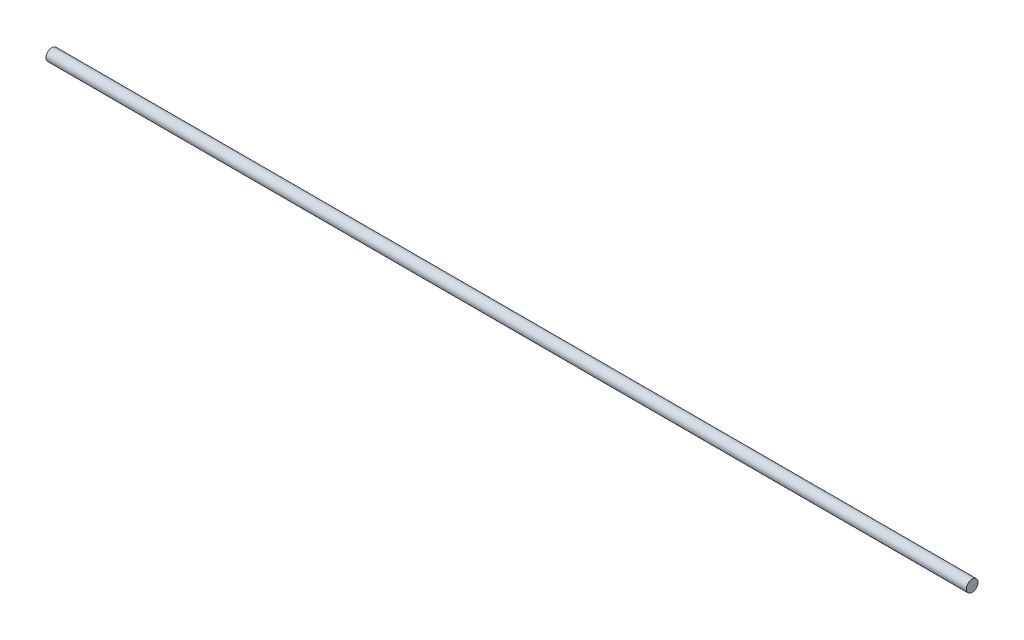
ISO-10303-21;
HEADER;
FILE_DESCRIPTION(('STEP AP214'),'2;1');
FILE_NAME('part.step','',(''),(''),'','','');
FILE_SCHEMA(('AUTOMOTIVE_DESIGN { 1 0 10303 214 1 1 1 1 }'));
ENDSEC;
DATA;
#1=APPLICATION_CONTEXT('core data for automotive mechanical design processes');
#2=APPLICATION_PROTOCOL_DEFINITION('international standard','automotive_design',2000,#1);
#3=PRODUCT_CONTEXT('',#1,'mechanical');
#4=PRODUCT('Part','Part','',(#3));
#5=PRODUCT_RELATED_PRODUCT_CATEGORY('part','',(#4));
#6=PRODUCT_DEFINITION_FORMATION('','',#4);
#7=PRODUCT_DEFINITION_CONTEXT('part definition',#1,'design');
#8=PRODUCT_DEFINITION('design','',#6,#7);
#9=PRODUCT_DEFINITION_SHAPE('','',#8);
#10=(LENGTH_UNIT() NAMED_UNIT(*) SI_UNIT(.MILLI.,.METRE.));
#11=(NAMED_UNIT(*) PLANE_ANGLE_UNIT() SI_UNIT($,.RADIAN.));
#12=(NAMED_UNIT(*) SI_UNIT($,.STERADIAN.) SOLID_ANGLE_UNIT());
#13=UNCERTAINTY_MEASURE_WITH_UNIT(LENGTH_MEASURE(1.E-05),#10,'distance_accuracy_value','');
#14=(GEOMETRIC_REPRESENTATION_CONTEXT(3) GLOBAL_UNCERTAINTY_ASSIGNED_CONTEXT((#13)) GLOBAL_UNIT_ASSIGNED_CONTEXT((#10,
#11,#12)) REPRESENTATION_CONTEXT('',''));
#15=CARTESIAN_POINT('',(0.,0.,0.));
#16=DIRECTION('',(0.,0.,1.));
#17=DIRECTION('',(1.,0.,0.));
#18=AXIS2_PLACEMENT_3D('',#15,#16,#17);
#19=CARTESIAN_POINT('',(393.,0.,0.));
#20=DIRECTION('',(-1.,0.,0.));
#21=DIRECTION('',(0.,0.,1.));
#22=AXIS2_PLACEMENT_3D('',#19,#20,#21);
#23=CYLINDRICAL_SURFACE('',#22,5.);
#24=CARTESIAN_POINT('',(393.,0.,0.));
#25=DIRECTION('',(1.,0.,0.));
#26=DIRECTION('',(0.,0.,-1.));
#27=AXIS2_PLACEMENT_3D('',#24,#25,#26);
#28=CIRCLE('',#27,5.);
#29=CARTESIAN_POINT('',(393.,0.,-5.));
#30=VERTEX_POINT('',#29);
#31=EDGE_CURVE('E10',#30,#30,#28,.T.);
#32=ORIENTED_EDGE('',*,*,#31,.F.);
#33=EDGE_LOOP('',(#32));
#34=FACE_BOUND('',#33,.T.);
#35=CARTESIAN_POINT('',(-393.,0.,0.));
#36=DIRECTION('',(1.,0.,0.));
#37=DIRECTION('',(0.,0.,-1.));
#38=AXIS2_PLACEMENT_3D('',#35,#36,#37);
#39=CIRCLE('',#38,5.);
#40=CARTESIAN_POINT('',(-393.,0.,-5.));
#41=VERTEX_POINT('',#40);
#42=EDGE_CURVE('E34',#41,#41,#39,.T.);
#43=ORIENTED_EDGE('',*,*,#42,.T.);
#44=EDGE_LOOP('',(#43));
#45=FACE_BOUND('',#44,.T.);
#46=ADVANCED_FACE('F31',(#34,#45),#23,.T.);
#47=CARTESIAN_POINT('',(393.,0.,0.));
#48=DIRECTION('',(1.,0.,0.));
#49=DIRECTION('',(0.,0.,-1.));
#50=AXIS2_PLACEMENT_3D('',#47,#48,#49);
#51=PLANE('',#50);
#52=ORIENTED_EDGE('',*,*,#31,.T.);
#53=EDGE_LOOP('',(#52));
#54=FACE_BOUND('',#53,.T.);
#55=ADVANCED_FACE('F46',(#54),#51,.T.);
#56=CARTESIAN_POINT('',(-393.,0.,0.));
#57=DIRECTION('',(1.,0.,0.));
#58=DIRECTION('',(0.,0.,-1.));
#59=AXIS2_PLACEMENT_3D('',#56,#57,#58);
#60=PLANE('',#59);
#61=ORIENTED_EDGE('',*,*,#42,.F.);
#62=EDGE_LOOP('',(#61));
#63=FACE_BOUND('',#62,.T.);
#64=ADVANCED_FACE('F44',(#63),#60,.F.);
#65=CLOSED_SHELL('',(#46,#55,#64));
#66=MANIFOLD_SOLID_BREP('B2',#65);
#67=ADVANCED_BREP_SHAPE_REPRESENTATION('',(#18,#66),#14);
#68=SHAPE_DEFINITION_REPRESENTATION(#9,#67);
ENDSEC;
END-ISO-10303-21;
